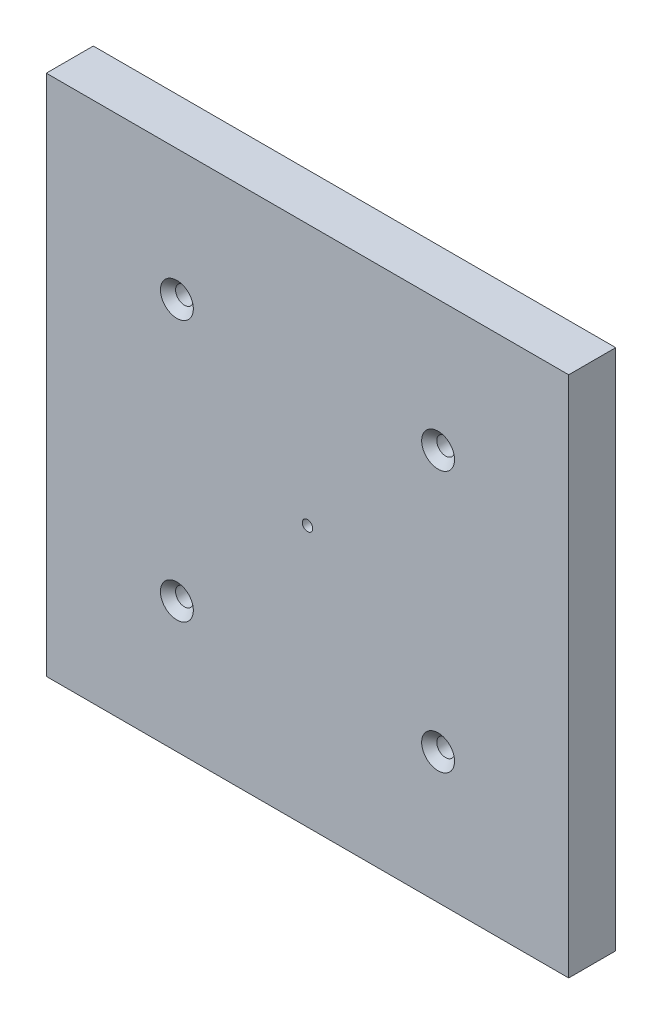
ISO-10303-21;
HEADER;
FILE_DESCRIPTION(('STEP AP214'),'2;1');
FILE_NAME('part.step','',(''),(''),'','','');
FILE_SCHEMA(('AUTOMOTIVE_DESIGN { 1 0 10303 214 1 1 1 1 }'));
ENDSEC;
DATA;
#1=APPLICATION_CONTEXT('core data for automotive mechanical design processes');
#2=APPLICATION_PROTOCOL_DEFINITION('international standard','automotive_design',2000,#1);
#3=PRODUCT_CONTEXT('',#1,'mechanical');
#4=PRODUCT('Part','Part','',(#3));
#5=PRODUCT_RELATED_PRODUCT_CATEGORY('part','',(#4));
#6=PRODUCT_DEFINITION_FORMATION('','',#4);
#7=PRODUCT_DEFINITION_CONTEXT('part definition',#1,'design');
#8=PRODUCT_DEFINITION('design','',#6,#7);
#9=PRODUCT_DEFINITION_SHAPE('','',#8);
#10=(LENGTH_UNIT() NAMED_UNIT(*) SI_UNIT(.MILLI.,.METRE.));
#11=(NAMED_UNIT(*) PLANE_ANGLE_UNIT() SI_UNIT($,.RADIAN.));
#12=(NAMED_UNIT(*) SI_UNIT($,.STERADIAN.) SOLID_ANGLE_UNIT());
#13=UNCERTAINTY_MEASURE_WITH_UNIT(LENGTH_MEASURE(1.E-05),#10,'distance_accuracy_value','');
#14=(GEOMETRIC_REPRESENTATION_CONTEXT(3) GLOBAL_UNCERTAINTY_ASSIGNED_CONTEXT((#13)) GLOBAL_UNIT_ASSIGNED_CONTEXT((#10,
#11,#12)) REPRESENTATION_CONTEXT('',''));
#15=CARTESIAN_POINT('',(0.,0.,0.));
#16=DIRECTION('',(0.,0.,1.));
#17=DIRECTION('',(1.,0.,0.));
#18=AXIS2_PLACEMENT_3D('',#15,#16,#17);
#19=CARTESIAN_POINT('',(50.,50.,9.));
#20=DIRECTION('',(-1.,0.,0.));
#21=DIRECTION('',(0.,-1.,0.));
#22=AXIS2_PLACEMENT_3D('',#19,#20,#21);
#23=PLANE('',#22);
#24=DIRECTION('',(0.,1.,0.));
#25=VECTOR('',#24,1.);
#26=CARTESIAN_POINT('',(50.,50.,0.));
#27=LINE('',#26,#25);
#28=CARTESIAN_POINT('',(50.,-50.,0.));
#29=VERTEX_POINT('',#28);
#30=CARTESIAN_POINT('',(50.,50.,0.));
#31=VERTEX_POINT('',#30);
#32=EDGE_CURVE('E179',#29,#31,#27,.T.);
#33=ORIENTED_EDGE('',*,*,#32,.T.);
#34=DIRECTION('',(0.,0.,-1.));
#35=VECTOR('',#34,1.);
#36=CARTESIAN_POINT('',(50.,50.,9.));
#37=LINE('',#36,#35);
#38=CARTESIAN_POINT('',(50.,50.,9.));
#39=VERTEX_POINT('',#38);
#40=EDGE_CURVE('E11',#39,#31,#37,.T.);
#41=ORIENTED_EDGE('',*,*,#40,.F.);
#42=DIRECTION('',(0.,1.,0.));
#43=VECTOR('',#42,1.);
#44=CARTESIAN_POINT('',(50.,50.,9.));
#45=LINE('',#44,#43);
#46=CARTESIAN_POINT('',(50.,-50.,9.));
#47=VERTEX_POINT('',#46);
#48=EDGE_CURVE('E180',#47,#39,#45,.T.);
#49=ORIENTED_EDGE('',*,*,#48,.F.);
#50=DIRECTION('',(0.,0.,-1.));
#51=VECTOR('',#50,1.);
#52=CARTESIAN_POINT('',(50.,-50.,9.));
#53=LINE('',#52,#51);
#54=EDGE_CURVE('E190',#47,#29,#53,.T.);
#55=ORIENTED_EDGE('',*,*,#54,.T.);
#56=EDGE_LOOP('',(#33,#41,#49,#55));
#57=FACE_BOUND('',#56,.T.);
#58=ADVANCED_FACE('F46',(#57),#23,.F.);
#59=CARTESIAN_POINT('',(-50.,50.,9.));
#60=DIRECTION('',(0.,-1.,0.));
#61=DIRECTION('',(0.,0.,-1.));
#62=AXIS2_PLACEMENT_3D('',#59,#60,#61);
#63=PLANE('',#62);
#64=DIRECTION('',(-1.,0.,0.));
#65=VECTOR('',#64,1.);
#66=CARTESIAN_POINT('',(-50.,50.,0.));
#67=LINE('',#66,#65);
#68=CARTESIAN_POINT('',(-50.,50.,0.));
#69=VERTEX_POINT('',#68);
#70=EDGE_CURVE('E194',#31,#69,#67,.T.);
#71=ORIENTED_EDGE('',*,*,#70,.T.);
#72=DIRECTION('',(0.,0.,-1.));
#73=VECTOR('',#72,1.);
#74=CARTESIAN_POINT('',(-50.,50.,9.));
#75=LINE('',#74,#73);
#76=CARTESIAN_POINT('',(-50.,50.,9.));
#77=VERTEX_POINT('',#76);
#78=EDGE_CURVE('E55',#77,#69,#75,.T.);
#79=ORIENTED_EDGE('',*,*,#78,.F.);
#80=DIRECTION('',(-1.,0.,0.));
#81=VECTOR('',#80,1.);
#82=CARTESIAN_POINT('',(-50.,50.,9.));
#83=LINE('',#82,#81);
#84=EDGE_CURVE('E94',#39,#77,#83,.T.);
#85=ORIENTED_EDGE('',*,*,#84,.F.);
#86=ORIENTED_EDGE('',*,*,#40,.T.);
#87=EDGE_LOOP('',(#71,#79,#85,#86));
#88=FACE_BOUND('',#87,.T.);
#89=ADVANCED_FACE('F224',(#88),#63,.F.);
#90=CARTESIAN_POINT('',(-50.,50.,9.));
#91=DIRECTION('',(1.,0.,0.));
#92=DIRECTION('',(0.,1.,0.));
#93=AXIS2_PLACEMENT_3D('',#90,#91,#92);
#94=PLANE('',#93);
#95=DIRECTION('',(0.,-1.,0.));
#96=VECTOR('',#95,1.);
#97=CARTESIAN_POINT('',(-50.,50.,0.));
#98=LINE('',#97,#96);
#99=CARTESIAN_POINT('',(-50.,-50.,0.));
#100=VERTEX_POINT('',#99);
#101=EDGE_CURVE('E81',#69,#100,#98,.T.);
#102=ORIENTED_EDGE('',*,*,#101,.T.);
#103=DIRECTION('',(0.,0.,-1.));
#104=VECTOR('',#103,1.);
#105=CARTESIAN_POINT('',(-50.,-50.,9.));
#106=LINE('',#105,#104);
#107=CARTESIAN_POINT('',(-50.,-50.,9.));
#108=VERTEX_POINT('',#107);
#109=EDGE_CURVE('E203',#108,#100,#106,.T.);
#110=ORIENTED_EDGE('',*,*,#109,.F.);
#111=DIRECTION('',(0.,-1.,0.));
#112=VECTOR('',#111,1.);
#113=CARTESIAN_POINT('',(-50.,50.,9.));
#114=LINE('',#113,#112);
#115=EDGE_CURVE('E185',#77,#108,#114,.T.);
#116=ORIENTED_EDGE('',*,*,#115,.F.);
#117=ORIENTED_EDGE('',*,*,#78,.T.);
#118=EDGE_LOOP('',(#102,#110,#116,#117));
#119=FACE_BOUND('',#118,.T.);
#120=ADVANCED_FACE('F207',(#119),#94,.F.);
#121=CARTESIAN_POINT('',(-50.,-50.,9.));
#122=DIRECTION('',(0.,1.,0.));
#123=DIRECTION('',(0.,0.,1.));
#124=AXIS2_PLACEMENT_3D('',#121,#122,#123);
#125=PLANE('',#124);
#126=DIRECTION('',(1.,0.,0.));
#127=VECTOR('',#126,1.);
#128=CARTESIAN_POINT('',(-50.,-50.,0.));
#129=LINE('',#128,#127);
#130=EDGE_CURVE('E87',#100,#29,#129,.T.);
#131=ORIENTED_EDGE('',*,*,#130,.T.);
#132=ORIENTED_EDGE('',*,*,#54,.F.);
#133=DIRECTION('',(1.,0.,0.));
#134=VECTOR('',#133,1.);
#135=CARTESIAN_POINT('',(-50.,-50.,9.));
#136=LINE('',#135,#134);
#137=EDGE_CURVE('E63',#108,#47,#136,.T.);
#138=ORIENTED_EDGE('',*,*,#137,.F.);
#139=ORIENTED_EDGE('',*,*,#109,.T.);
#140=EDGE_LOOP('',(#131,#132,#138,#139));
#141=FACE_BOUND('',#140,.T.);
#142=ADVANCED_FACE('F214',(#141),#125,.F.);
#143=CARTESIAN_POINT('',(0.,0.,9.));
#144=DIRECTION('',(0.,0.,1.));
#145=DIRECTION('',(1.,0.,0.));
#146=AXIS2_PLACEMENT_3D('',#143,#144,#145);
#147=PLANE('',#146);
#148=CARTESIAN_POINT('',(0.,0.,9.));
#149=DIRECTION('',(0.,0.,1.));
#150=DIRECTION('',(1.,0.,0.));
#151=AXIS2_PLACEMENT_3D('',#148,#149,#150);
#152=CIRCLE('',#151,0.999999999999989);
#153=CARTESIAN_POINT('',(0.999999999999989,0.,9.));
#154=VERTEX_POINT('',#153);
#155=EDGE_CURVE('E110',#154,#154,#152,.T.);
#156=ORIENTED_EDGE('',*,*,#155,.F.);
#157=EDGE_LOOP('',(#156));
#158=FACE_BOUND('',#157,.T.);
#159=CARTESIAN_POINT('',(-25.,25.,9.));
#160=DIRECTION('',(0.,0.,1.));
#161=DIRECTION('',(1.,0.,0.));
#162=AXIS2_PLACEMENT_3D('',#159,#160,#161);
#163=CIRCLE('',#162,3.15);
#164=CARTESIAN_POINT('',(-21.85,25.,9.));
#165=VERTEX_POINT('',#164);
#166=EDGE_CURVE('E115',#165,#165,#163,.T.);
#167=ORIENTED_EDGE('',*,*,#166,.F.);
#168=EDGE_LOOP('',(#167));
#169=FACE_BOUND('',#168,.T.);
#170=CARTESIAN_POINT('',(25.,25.,9.));
#171=DIRECTION('',(0.,0.,1.));
#172=DIRECTION('',(1.,0.,0.));
#173=AXIS2_PLACEMENT_3D('',#170,#171,#172);
#174=CIRCLE('',#173,3.15);
#175=CARTESIAN_POINT('',(28.15,25.,9.));
#176=VERTEX_POINT('',#175);
#177=EDGE_CURVE('E135',#176,#176,#174,.T.);
#178=ORIENTED_EDGE('',*,*,#177,.F.);
#179=EDGE_LOOP('',(#178));
#180=FACE_BOUND('',#179,.T.);
#181=CARTESIAN_POINT('',(25.,-25.,9.));
#182=DIRECTION('',(0.,0.,1.));
#183=DIRECTION('',(1.,0.,0.));
#184=AXIS2_PLACEMENT_3D('',#181,#182,#183);
#185=CIRCLE('',#184,3.15);
#186=CARTESIAN_POINT('',(28.15,-25.,9.));
#187=VERTEX_POINT('',#186);
#188=EDGE_CURVE('E151',#187,#187,#185,.T.);
#189=ORIENTED_EDGE('',*,*,#188,.F.);
#190=EDGE_LOOP('',(#189));
#191=FACE_BOUND('',#190,.T.);
#192=CARTESIAN_POINT('',(-25.,-25.,9.));
#193=DIRECTION('',(0.,0.,1.));
#194=DIRECTION('',(1.,0.,0.));
#195=AXIS2_PLACEMENT_3D('',#192,#193,#194);
#196=CIRCLE('',#195,3.15);
#197=CARTESIAN_POINT('',(-21.85,-25.,9.));
#198=VERTEX_POINT('',#197);
#199=EDGE_CURVE('E167',#198,#198,#196,.T.);
#200=ORIENTED_EDGE('',*,*,#199,.F.);
#201=EDGE_LOOP('',(#200));
#202=FACE_BOUND('',#201,.T.);
#203=ORIENTED_EDGE('',*,*,#48,.T.);
#204=ORIENTED_EDGE('',*,*,#84,.T.);
#205=ORIENTED_EDGE('',*,*,#115,.T.);
#206=ORIENTED_EDGE('',*,*,#137,.T.);
#207=EDGE_LOOP('',(#203,#204,#205,#206));
#208=FACE_BOUND('',#207,.T.);
#209=ADVANCED_FACE('F216',(#158,#169,#180,#191,#202,#208),#147,.T.);
#210=CARTESIAN_POINT('',(0.,0.,0.));
#211=DIRECTION('',(0.,0.,1.));
#212=DIRECTION('',(1.,0.,0.));
#213=AXIS2_PLACEMENT_3D('',#210,#211,#212);
#214=PLANE('',#213);
#215=CARTESIAN_POINT('',(-25.,25.,0.));
#216=DIRECTION('',(0.,0.,1.));
#217=DIRECTION('',(1.,0.,0.));
#218=AXIS2_PLACEMENT_3D('',#215,#216,#217);
#219=CIRCLE('',#218,1.725);
#220=CARTESIAN_POINT('',(-23.275,25.,0.));
#221=VERTEX_POINT('',#220);
#222=EDGE_CURVE('E109',#221,#221,#219,.T.);
#223=ORIENTED_EDGE('',*,*,#222,.T.);
#224=EDGE_LOOP('',(#223));
#225=FACE_BOUND('',#224,.T.);
#226=CARTESIAN_POINT('',(25.,25.,0.));
#227=DIRECTION('',(0.,0.,1.));
#228=DIRECTION('',(1.,0.,0.));
#229=AXIS2_PLACEMENT_3D('',#226,#227,#228);
#230=CIRCLE('',#229,1.725);
#231=CARTESIAN_POINT('',(26.725,25.,0.));
#232=VERTEX_POINT('',#231);
#233=EDGE_CURVE('E131',#232,#232,#230,.T.);
#234=ORIENTED_EDGE('',*,*,#233,.T.);
#235=EDGE_LOOP('',(#234));
#236=FACE_BOUND('',#235,.T.);
#237=CARTESIAN_POINT('',(25.,-25.,0.));
#238=DIRECTION('',(0.,0.,1.));
#239=DIRECTION('',(1.,0.,0.));
#240=AXIS2_PLACEMENT_3D('',#237,#238,#239);
#241=CIRCLE('',#240,1.725);
#242=CARTESIAN_POINT('',(26.725,-25.,0.));
#243=VERTEX_POINT('',#242);
#244=EDGE_CURVE('E147',#243,#243,#241,.T.);
#245=ORIENTED_EDGE('',*,*,#244,.T.);
#246=EDGE_LOOP('',(#245));
#247=FACE_BOUND('',#246,.T.);
#248=CARTESIAN_POINT('',(-25.,-25.,0.));
#249=DIRECTION('',(0.,0.,1.));
#250=DIRECTION('',(1.,0.,0.));
#251=AXIS2_PLACEMENT_3D('',#248,#249,#250);
#252=CIRCLE('',#251,1.725);
#253=CARTESIAN_POINT('',(-23.275,-25.,0.));
#254=VERTEX_POINT('',#253);
#255=EDGE_CURVE('E163',#254,#254,#252,.T.);
#256=ORIENTED_EDGE('',*,*,#255,.T.);
#257=EDGE_LOOP('',(#256));
#258=FACE_BOUND('',#257,.T.);
#259=ORIENTED_EDGE('',*,*,#32,.F.);
#260=ORIENTED_EDGE('',*,*,#130,.F.);
#261=ORIENTED_EDGE('',*,*,#101,.F.);
#262=ORIENTED_EDGE('',*,*,#70,.F.);
#263=EDGE_LOOP('',(#259,#260,#261,#262));
#264=FACE_BOUND('',#263,.T.);
#265=ADVANCED_FACE('F210',(#225,#236,#247,#258,#264),#214,.F.);
#266=CARTESIAN_POINT('',(-25.,-25.,0.0250000000000007));
#267=DIRECTION('',(0.,0.,-1.));
#268=DIRECTION('',(-1.,0.,0.));
#269=AXIS2_PLACEMENT_3D('',#266,#267,#268);
#270=CONICAL_SURFACE('',#269,1.7,0.785398163397448);
#271=ORIENTED_EDGE('',*,*,#255,.F.);
#272=EDGE_LOOP('',(#271));
#273=FACE_BOUND('',#272,.T.);
#274=CARTESIAN_POINT('',(-25.,-25.,0.0250000000000007));
#275=DIRECTION('',(0.,0.,1.));
#276=DIRECTION('',(1.,0.,0.));
#277=AXIS2_PLACEMENT_3D('',#274,#275,#276);
#278=CIRCLE('',#277,1.7);
#279=CARTESIAN_POINT('',(-23.3,-25.,0.0250000000000007));
#280=VERTEX_POINT('',#279);
#281=EDGE_CURVE('E175',#280,#280,#278,.T.);
#282=ORIENTED_EDGE('',*,*,#281,.T.);
#283=EDGE_LOOP('',(#282));
#284=FACE_BOUND('',#283,.T.);
#285=ADVANCED_FACE('F253',(#273,#284),#270,.F.);
#286=CARTESIAN_POINT('',(-25.,-25.,9.));
#287=DIRECTION('',(0.,0.,1.));
#288=DIRECTION('',(1.,0.,0.));
#289=AXIS2_PLACEMENT_3D('',#286,#287,#288);
#290=CYLINDRICAL_SURFACE('',#289,1.7);
#291=ORIENTED_EDGE('',*,*,#281,.F.);
#292=EDGE_LOOP('',(#291));
#293=FACE_BOUND('',#292,.T.);
#294=CARTESIAN_POINT('',(-25.,-25.,7.55));
#295=DIRECTION('',(0.,0.,1.));
#296=DIRECTION('',(1.,0.,0.));
#297=AXIS2_PLACEMENT_3D('',#294,#295,#296);
#298=CIRCLE('',#297,1.7);
#299=CARTESIAN_POINT('',(-23.3,-25.,7.55));
#300=VERTEX_POINT('',#299);
#301=EDGE_CURVE('E171',#300,#300,#298,.T.);
#302=ORIENTED_EDGE('',*,*,#301,.T.);
#303=EDGE_LOOP('',(#302));
#304=FACE_BOUND('',#303,.T.);
#305=ADVANCED_FACE('F263',(#293,#304),#290,.F.);
#306=CARTESIAN_POINT('',(-25.,-25.,9.));
#307=DIRECTION('',(0.,0.,1.));
#308=DIRECTION('',(1.,0.,0.));
#309=AXIS2_PLACEMENT_3D('',#306,#307,#308);
#310=CONICAL_SURFACE('',#309,3.15,0.785398163397449);
#311=ORIENTED_EDGE('',*,*,#301,.F.);
#312=EDGE_LOOP('',(#311));
#313=FACE_BOUND('',#312,.T.);
#314=ORIENTED_EDGE('',*,*,#199,.T.);
#315=EDGE_LOOP('',(#314));
#316=FACE_BOUND('',#315,.T.);
#317=ADVANCED_FACE('F274',(#313,#316),#310,.F.);
#318=CARTESIAN_POINT('',(25.,-25.,0.0250000000000007));
#319=DIRECTION('',(0.,0.,-1.));
#320=DIRECTION('',(-1.,0.,0.));
#321=AXIS2_PLACEMENT_3D('',#318,#319,#320);
#322=CONICAL_SURFACE('',#321,1.7,0.785398163397448);
#323=ORIENTED_EDGE('',*,*,#244,.F.);
#324=EDGE_LOOP('',(#323));
#325=FACE_BOUND('',#324,.T.);
#326=CARTESIAN_POINT('',(25.,-25.,0.0250000000000007));
#327=DIRECTION('',(0.,0.,1.));
#328=DIRECTION('',(1.,0.,0.));
#329=AXIS2_PLACEMENT_3D('',#326,#327,#328);
#330=CIRCLE('',#329,1.7);
#331=CARTESIAN_POINT('',(26.7,-25.,0.0250000000000007));
#332=VERTEX_POINT('',#331);
#333=EDGE_CURVE('E159',#332,#332,#330,.T.);
#334=ORIENTED_EDGE('',*,*,#333,.T.);
#335=EDGE_LOOP('',(#334));
#336=FACE_BOUND('',#335,.T.);
#337=ADVANCED_FACE('F285',(#325,#336),#322,.F.);
#338=CARTESIAN_POINT('',(25.,-25.,9.));
#339=DIRECTION('',(0.,0.,1.));
#340=DIRECTION('',(1.,0.,0.));
#341=AXIS2_PLACEMENT_3D('',#338,#339,#340);
#342=CYLINDRICAL_SURFACE('',#341,1.7);
#343=ORIENTED_EDGE('',*,*,#333,.F.);
#344=EDGE_LOOP('',(#343));
#345=FACE_BOUND('',#344,.T.);
#346=CARTESIAN_POINT('',(25.,-25.,7.55));
#347=DIRECTION('',(0.,0.,1.));
#348=DIRECTION('',(1.,0.,0.));
#349=AXIS2_PLACEMENT_3D('',#346,#347,#348);
#350=CIRCLE('',#349,1.7);
#351=CARTESIAN_POINT('',(26.7,-25.,7.55));
#352=VERTEX_POINT('',#351);
#353=EDGE_CURVE('E155',#352,#352,#350,.T.);
#354=ORIENTED_EDGE('',*,*,#353,.T.);
#355=EDGE_LOOP('',(#354));
#356=FACE_BOUND('',#355,.T.);
#357=ADVANCED_FACE('F296',(#345,#356),#342,.F.);
#358=CARTESIAN_POINT('',(25.,-25.,9.));
#359=DIRECTION('',(0.,0.,1.));
#360=DIRECTION('',(1.,0.,0.));
#361=AXIS2_PLACEMENT_3D('',#358,#359,#360);
#362=CONICAL_SURFACE('',#361,3.15,0.785398163397449);
#363=ORIENTED_EDGE('',*,*,#353,.F.);
#364=EDGE_LOOP('',(#363));
#365=FACE_BOUND('',#364,.T.);
#366=ORIENTED_EDGE('',*,*,#188,.T.);
#367=EDGE_LOOP('',(#366));
#368=FACE_BOUND('',#367,.T.);
#369=ADVANCED_FACE('F307',(#365,#368),#362,.F.);
#370=CARTESIAN_POINT('',(25.,25.,0.0250000000000007));
#371=DIRECTION('',(0.,0.,-1.));
#372=DIRECTION('',(-1.,0.,0.));
#373=AXIS2_PLACEMENT_3D('',#370,#371,#372);
#374=CONICAL_SURFACE('',#373,1.7,0.785398163397448);
#375=ORIENTED_EDGE('',*,*,#233,.F.);
#376=EDGE_LOOP('',(#375));
#377=FACE_BOUND('',#376,.T.);
#378=CARTESIAN_POINT('',(25.,25.,0.0250000000000007));
#379=DIRECTION('',(0.,0.,1.));
#380=DIRECTION('',(1.,0.,0.));
#381=AXIS2_PLACEMENT_3D('',#378,#379,#380);
#382=CIRCLE('',#381,1.7);
#383=CARTESIAN_POINT('',(26.7,25.,0.0250000000000007));
#384=VERTEX_POINT('',#383);
#385=EDGE_CURVE('E143',#384,#384,#382,.T.);
#386=ORIENTED_EDGE('',*,*,#385,.T.);
#387=EDGE_LOOP('',(#386));
#388=FACE_BOUND('',#387,.T.);
#389=ADVANCED_FACE('F318',(#377,#388),#374,.F.);
#390=CARTESIAN_POINT('',(25.,25.,9.));
#391=DIRECTION('',(0.,0.,1.));
#392=DIRECTION('',(1.,0.,0.));
#393=AXIS2_PLACEMENT_3D('',#390,#391,#392);
#394=CYLINDRICAL_SURFACE('',#393,1.7);
#395=ORIENTED_EDGE('',*,*,#385,.F.);
#396=EDGE_LOOP('',(#395));
#397=FACE_BOUND('',#396,.T.);
#398=CARTESIAN_POINT('',(25.,25.,7.55));
#399=DIRECTION('',(0.,0.,1.));
#400=DIRECTION('',(1.,0.,0.));
#401=AXIS2_PLACEMENT_3D('',#398,#399,#400);
#402=CIRCLE('',#401,1.7);
#403=CARTESIAN_POINT('',(26.7,25.,7.55));
#404=VERTEX_POINT('',#403);
#405=EDGE_CURVE('E139',#404,#404,#402,.T.);
#406=ORIENTED_EDGE('',*,*,#405,.T.);
#407=EDGE_LOOP('',(#406));
#408=FACE_BOUND('',#407,.T.);
#409=ADVANCED_FACE('F329',(#397,#408),#394,.F.);
#410=CARTESIAN_POINT('',(25.,25.,9.));
#411=DIRECTION('',(0.,0.,1.));
#412=DIRECTION('',(1.,0.,0.));
#413=AXIS2_PLACEMENT_3D('',#410,#411,#412);
#414=CONICAL_SURFACE('',#413,3.15,0.785398163397449);
#415=ORIENTED_EDGE('',*,*,#405,.F.);
#416=EDGE_LOOP('',(#415));
#417=FACE_BOUND('',#416,.T.);
#418=ORIENTED_EDGE('',*,*,#177,.T.);
#419=EDGE_LOOP('',(#418));
#420=FACE_BOUND('',#419,.T.);
#421=ADVANCED_FACE('F340',(#417,#420),#414,.F.);
#422=CARTESIAN_POINT('',(-25.,25.,0.0250000000000007));
#423=DIRECTION('',(0.,0.,-1.));
#424=DIRECTION('',(-1.,0.,0.));
#425=AXIS2_PLACEMENT_3D('',#422,#423,#424);
#426=CONICAL_SURFACE('',#425,1.7,0.785398163397448);
#427=ORIENTED_EDGE('',*,*,#222,.F.);
#428=EDGE_LOOP('',(#427));
#429=FACE_BOUND('',#428,.T.);
#430=CARTESIAN_POINT('',(-25.,25.,0.0250000000000007));
#431=DIRECTION('',(0.,0.,1.));
#432=DIRECTION('',(1.,0.,0.));
#433=AXIS2_PLACEMENT_3D('',#430,#431,#432);
#434=CIRCLE('',#433,1.7);
#435=CARTESIAN_POINT('',(-23.3,25.,0.0250000000000007));
#436=VERTEX_POINT('',#435);
#437=EDGE_CURVE('E127',#436,#436,#434,.T.);
#438=ORIENTED_EDGE('',*,*,#437,.T.);
#439=EDGE_LOOP('',(#438));
#440=FACE_BOUND('',#439,.T.);
#441=ADVANCED_FACE('F351',(#429,#440),#426,.F.);
#442=CARTESIAN_POINT('',(-25.,25.,9.));
#443=DIRECTION('',(0.,0.,1.));
#444=DIRECTION('',(1.,0.,0.));
#445=AXIS2_PLACEMENT_3D('',#442,#443,#444);
#446=CYLINDRICAL_SURFACE('',#445,1.7);
#447=ORIENTED_EDGE('',*,*,#437,.F.);
#448=EDGE_LOOP('',(#447));
#449=FACE_BOUND('',#448,.T.);
#450=CARTESIAN_POINT('',(-25.,25.,7.55));
#451=DIRECTION('',(0.,0.,1.));
#452=DIRECTION('',(1.,0.,0.));
#453=AXIS2_PLACEMENT_3D('',#450,#451,#452);
#454=CIRCLE('',#453,1.7);
#455=CARTESIAN_POINT('',(-23.3,25.,7.55));
#456=VERTEX_POINT('',#455);
#457=EDGE_CURVE('E123',#456,#456,#454,.T.);
#458=ORIENTED_EDGE('',*,*,#457,.T.);
#459=EDGE_LOOP('',(#458));
#460=FACE_BOUND('',#459,.T.);
#461=ADVANCED_FACE('F362',(#449,#460),#446,.F.);
#462=CARTESIAN_POINT('',(-25.,25.,9.));
#463=DIRECTION('',(0.,0.,1.));
#464=DIRECTION('',(1.,0.,0.));
#465=AXIS2_PLACEMENT_3D('',#462,#463,#464);
#466=CONICAL_SURFACE('',#465,3.15,0.785398163397449);
#467=ORIENTED_EDGE('',*,*,#457,.F.);
#468=EDGE_LOOP('',(#467));
#469=FACE_BOUND('',#468,.T.);
#470=ORIENTED_EDGE('',*,*,#166,.T.);
#471=EDGE_LOOP('',(#470));
#472=FACE_BOUND('',#471,.T.);
#473=ADVANCED_FACE('F102',(#469,#472),#466,.F.);
#474=CARTESIAN_POINT('',(0.,0.,3.60086061902756));
#475=DIRECTION('',(0.,0.,1.));
#476=DIRECTION('',(1.,0.,0.));
#477=AXIS2_PLACEMENT_3D('',#474,#475,#476);
#478=CONICAL_SURFACE('',#477,0.999999999999999,1.02974425867665);
#479=CARTESIAN_POINT('',(0.,0.,3.));
#480=VERTEX_POINT('',#479);
#481=VERTEX_LOOP('',#480);
#482=FACE_BOUND('',#481,.T.);
#483=CARTESIAN_POINT('',(0.,0.,3.60086061902756));
#484=DIRECTION('',(0.,0.,1.));
#485=DIRECTION('',(1.,0.,0.));
#486=AXIS2_PLACEMENT_3D('',#483,#484,#485);
#487=CIRCLE('',#486,0.999999999999999);
#488=CARTESIAN_POINT('',(0.999999999999999,0.,3.60086061902756));
#489=VERTEX_POINT('',#488);
#490=EDGE_CURVE('E106',#489,#489,#487,.T.);
#491=ORIENTED_EDGE('',*,*,#490,.T.);
#492=EDGE_LOOP('',(#491));
#493=FACE_BOUND('',#492,.T.);
#494=ADVANCED_FACE('F98',(#482,#493),#478,.F.);
#495=CARTESIAN_POINT('',(0.,0.,9.));
#496=DIRECTION('',(0.,0.,1.));
#497=DIRECTION('',(1.,0.,0.));
#498=AXIS2_PLACEMENT_3D('',#495,#496,#497);
#499=CYLINDRICAL_SURFACE('',#498,0.999999999999994);
#500=ORIENTED_EDGE('',*,*,#490,.F.);
#501=EDGE_LOOP('',(#500));
#502=FACE_BOUND('',#501,.T.);
#503=ORIENTED_EDGE('',*,*,#155,.T.);
#504=EDGE_LOOP('',(#503));
#505=FACE_BOUND('',#504,.T.);
#506=ADVANCED_FACE('F101',(#502,#505),#499,.F.);
#507=CLOSED_SHELL('',(#58,#89,#120,#142,#209,#265,#285,#305,#317,#337,#357,#369,#389,#409,#421,
#441,#461,#473,#494,#506));
#508=MANIFOLD_SOLID_BREP('B2',#507);
#509=ADVANCED_BREP_SHAPE_REPRESENTATION('',(#18,#508),#14);
#510=SHAPE_DEFINITION_REPRESENTATION(#9,#509);
ENDSEC;
END-ISO-10303-21;
